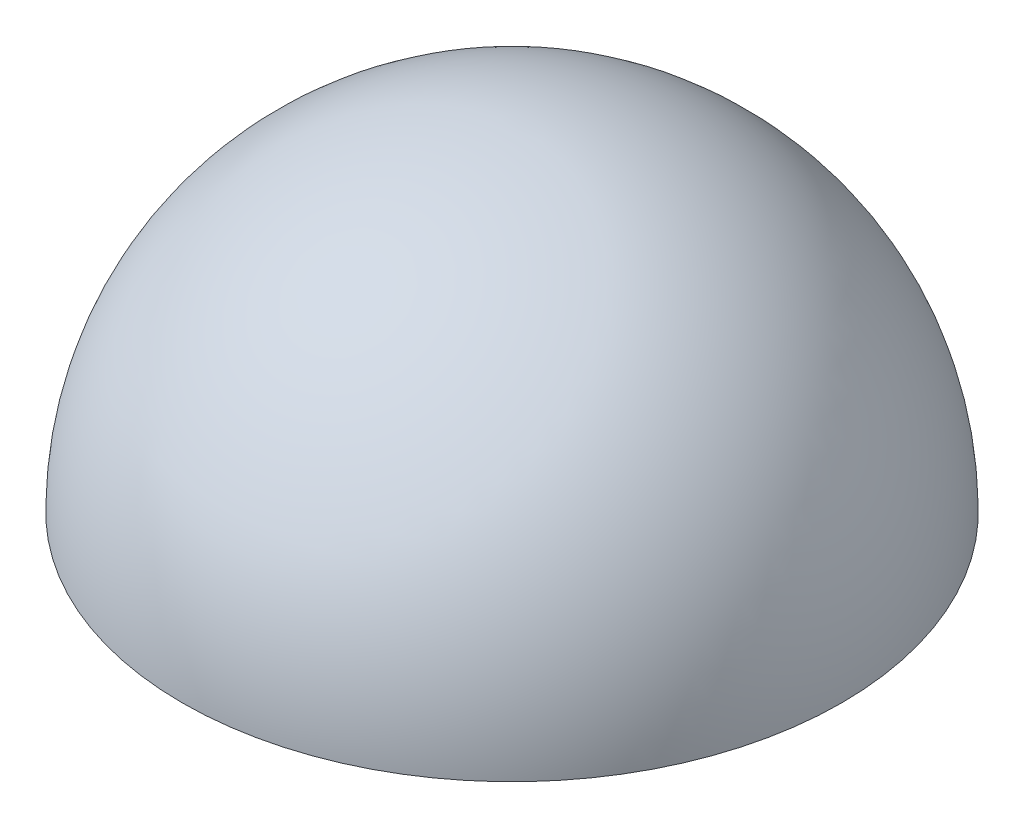
ISO-10303-21;
HEADER;
FILE_DESCRIPTION(('STEP AP214'),'2;1');
FILE_NAME('part.step','',(''),(''),'','','');
FILE_SCHEMA(('AUTOMOTIVE_DESIGN { 1 0 10303 214 1 1 1 1 }'));
ENDSEC;
DATA;
#1=APPLICATION_CONTEXT('core data for automotive mechanical design processes');
#2=APPLICATION_PROTOCOL_DEFINITION('international standard','automotive_design',2000,#1);
#3=PRODUCT_CONTEXT('',#1,'mechanical');
#4=PRODUCT('Part','Part','',(#3));
#5=PRODUCT_RELATED_PRODUCT_CATEGORY('part','',(#4));
#6=PRODUCT_DEFINITION_FORMATION('','',#4);
#7=PRODUCT_DEFINITION_CONTEXT('part definition',#1,'design');
#8=PRODUCT_DEFINITION('design','',#6,#7);
#9=PRODUCT_DEFINITION_SHAPE('','',#8);
#10=(LENGTH_UNIT() NAMED_UNIT(*) SI_UNIT(.MILLI.,.METRE.));
#11=(NAMED_UNIT(*) PLANE_ANGLE_UNIT() SI_UNIT($,.RADIAN.));
#12=(NAMED_UNIT(*) SI_UNIT($,.STERADIAN.) SOLID_ANGLE_UNIT());
#13=UNCERTAINTY_MEASURE_WITH_UNIT(LENGTH_MEASURE(1.E-05),#10,'distance_accuracy_value','');
#14=(GEOMETRIC_REPRESENTATION_CONTEXT(3) GLOBAL_UNCERTAINTY_ASSIGNED_CONTEXT((#13)) GLOBAL_UNIT_ASSIGNED_CONTEXT((#10,
#11,#12)) REPRESENTATION_CONTEXT('',''));
#15=CARTESIAN_POINT('',(0.,0.,0.));
#16=DIRECTION('',(0.,0.,1.));
#17=DIRECTION('',(1.,0.,0.));
#18=AXIS2_PLACEMENT_3D('',#15,#16,#17);
#19=CARTESIAN_POINT('',(0.,0.,0.));
#20=DIRECTION('',(0.,1.,0.));
#21=DIRECTION('',(1.,0.,0.));
#22=AXIS2_PLACEMENT_3D('',#19,#20,#21);
#23=SPHERICAL_SURFACE('',#22,16.75);
#24=CARTESIAN_POINT('',(0.,0.,0.));
#25=DIRECTION('',(0.,1.,0.));
#26=DIRECTION('',(0.,0.,1.));
#27=AXIS2_PLACEMENT_3D('',#24,#25,#26);
#28=CIRCLE('',#27,16.75);
#29=CARTESIAN_POINT('',(0.,0.,16.75));
#30=VERTEX_POINT('',#29);
#31=EDGE_CURVE('E10',#30,#30,#28,.T.);
#32=ORIENTED_EDGE('',*,*,#31,.T.);
#33=EDGE_LOOP('',(#32));
#34=FACE_BOUND('',#33,.T.);
#35=ADVANCED_FACE('F37',(#34),#23,.T.);
#36=CARTESIAN_POINT('',(16.75,0.,0.));
#37=DIRECTION('',(0.,1.,0.));
#38=DIRECTION('',(0.,0.,1.));
#39=AXIS2_PLACEMENT_3D('',#36,#37,#38);
#40=PLANE('',#39);
#41=ORIENTED_EDGE('',*,*,#31,.F.);
#42=EDGE_LOOP('',(#41));
#43=FACE_BOUND('',#42,.T.);
#44=ADVANCED_FACE('F46',(#43),#40,.F.);
#45=CLOSED_SHELL('',(#35,#44));
#46=MANIFOLD_SOLID_BREP('B2',#45);
#47=ADVANCED_BREP_SHAPE_REPRESENTATION('',(#18,#46),#14);
#48=SHAPE_DEFINITION_REPRESENTATION(#9,#47);
ENDSEC;
END-ISO-10303-21;
